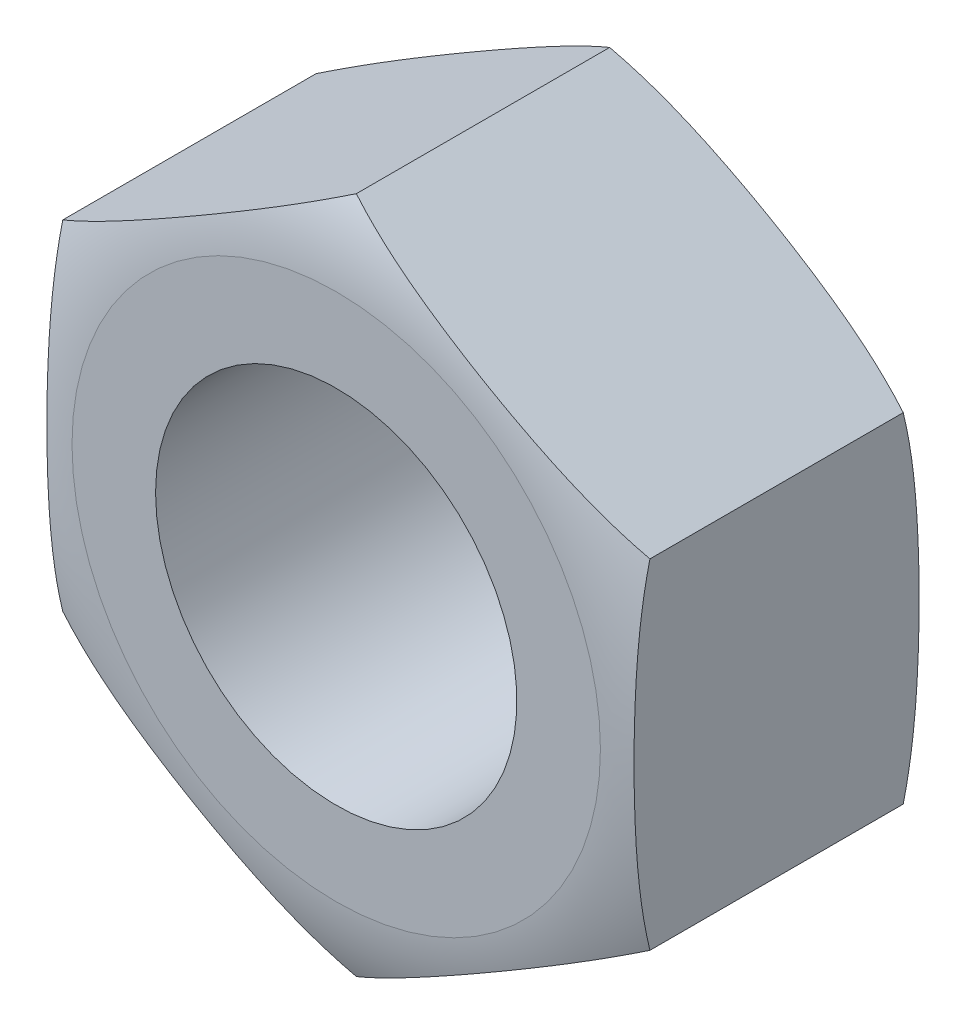
ISO-10303-21;
HEADER;
FILE_DESCRIPTION(('STEP AP214'),'2;1');
FILE_NAME('part.step','',(''),(''),'','','');
FILE_SCHEMA(('AUTOMOTIVE_DESIGN { 1 0 10303 214 1 1 1 1 }'));
ENDSEC;
DATA;
#1=APPLICATION_CONTEXT('core data for automotive mechanical design processes');
#2=APPLICATION_PROTOCOL_DEFINITION('international standard','automotive_design',2000,#1);
#3=PRODUCT_CONTEXT('',#1,'mechanical');
#4=PRODUCT('Part','Part','',(#3));
#5=PRODUCT_RELATED_PRODUCT_CATEGORY('part','',(#4));
#6=PRODUCT_DEFINITION_FORMATION('','',#4);
#7=PRODUCT_DEFINITION_CONTEXT('part definition',#1,'design');
#8=PRODUCT_DEFINITION('design','',#6,#7);
#9=PRODUCT_DEFINITION_SHAPE('','',#8);
#10=(LENGTH_UNIT() NAMED_UNIT(*) SI_UNIT(.MILLI.,.METRE.));
#11=(NAMED_UNIT(*) PLANE_ANGLE_UNIT() SI_UNIT($,.RADIAN.));
#12=(NAMED_UNIT(*) SI_UNIT($,.STERADIAN.) SOLID_ANGLE_UNIT());
#13=UNCERTAINTY_MEASURE_WITH_UNIT(LENGTH_MEASURE(1.E-05),#10,'distance_accuracy_value','');
#14=(GEOMETRIC_REPRESENTATION_CONTEXT(3) GLOBAL_UNCERTAINTY_ASSIGNED_CONTEXT((#13)) GLOBAL_UNIT_ASSIGNED_CONTEXT((#10,
#11,#12)) REPRESENTATION_CONTEXT('',''));
#15=CARTESIAN_POINT('',(0.,0.,0.));
#16=DIRECTION('',(0.,0.,1.));
#17=DIRECTION('',(1.,0.,0.));
#18=AXIS2_PLACEMENT_3D('',#15,#16,#17);
#19=CARTESIAN_POINT('',(-6.5,-3.75277674973257,0.));
#20=DIRECTION('',(-0.499999999999999,-0.866025403784439,0.));
#21=DIRECTION('',(0.866025403784439,-0.499999999999999,0.));
#22=AXIS2_PLACEMENT_3D('',#19,#20,#21);
#23=PLANE('',#22);
#24=CARTESIAN_POINT('',(-6.4999999999951,-3.75277674973539,-0.44572357986711));
#25=CARTESIAN_POINT('',(-6.368450040803,-3.82872715408684,-0.408618470883462));
#26=CARTESIAN_POINT('',(-6.23608776526573,-3.90514654949884,-0.375601053638122));
#27=CARTESIAN_POINT('',(-5.97026407564765,-4.05861992825681,-0.316718428748714));
#28=CARTESIAN_POINT('',(-5.83680349779314,-4.13567342880732,-0.290848219829598));
#29=CARTESIAN_POINT('',(-5.56939253886856,-4.29006321792668,-0.245233700435676));
#30=CARTESIAN_POINT('',(-5.43544368616804,-4.36739862409096,-0.225477154032766));
#31=CARTESIAN_POINT('',(-5.16703730043745,-4.52236312314474,-0.191050748299597));
#32=CARTESIAN_POINT('',(-5.03257967274308,-4.59999227068868,-0.176381887933316));
#33=CARTESIAN_POINT('',(-4.7633216465234,-4.75544846460808,-0.151265096656616));
#34=CARTESIAN_POINT('',(-4.62852113217613,-4.83327557785338,-0.140818860549731));
#35=CARTESIAN_POINT('',(-4.35874977954435,-4.98902814091498,-0.123427298866689));
#36=CARTESIAN_POINT('',(-4.22377893499881,-5.0669535943461,-0.116482105976505));
#37=CARTESIAN_POINT('',(-3.95584957944127,-5.22164267990105,-0.105623597627342));
#38=CARTESIAN_POINT('',(-3.82289240998474,-5.29840553747747,-0.101664819635423));
#39=CARTESIAN_POINT('',(-3.55693979498536,-5.45195335133904,-0.096265182081627));
#40=CARTESIAN_POINT('',(-3.42394434916413,-5.52873830778492,-0.0948243413204007));
#41=CARTESIAN_POINT('',(-3.15788410360645,-5.68234826217831,-0.0943305243682219));
#42=CARTESIAN_POINT('',(-3.02481930228376,-5.75917326104163,-0.0952787365012622));
#43=CARTESIAN_POINT('',(-2.75871721010348,-5.91280737559384,-0.0996515393486421));
#44=CARTESIAN_POINT('',(-2.62567991969272,-5.98961649102474,-0.103076167541168));
#45=CARTESIAN_POINT('',(-2.35970137523026,-6.14317927526881,-0.112698458153194));
#46=CARTESIAN_POINT('',(-2.22676010874288,-6.21993295126171,-0.118895651549672));
#47=CARTESIAN_POINT('',(-1.96102514909866,-6.37335510174539,-0.134553718769911));
#48=CARTESIAN_POINT('',(-1.82823144731737,-6.45002358121551,-0.144014390571887));
#49=CARTESIAN_POINT('',(-1.60071067527127,-6.58138276020255,-0.163606483940176));
#50=CARTESIAN_POINT('',(-1.50592177239597,-6.6361091587938,-0.172778139397991));
#51=CARTESIAN_POINT('',(-1.31656938197012,-6.74543181237786,-0.193412297813003));
#52=CARTESIAN_POINT('',(-1.2220058161491,-6.80002811256016,-0.204873831994563));
#53=CARTESIAN_POINT('',(-1.03317708594434,-6.90904843077461,-0.230399342474371));
#54=CARTESIAN_POINT('',(-0.93891182056807,-6.96347250711483,-0.244462313690016));
#55=CARTESIAN_POINT('',(-0.750275258575396,-7.07238187696031,-0.275608769491587));
#56=CARTESIAN_POINT('',(-0.655905766995885,-7.12686612832703,-0.292706931049049));
#57=CARTESIAN_POINT('',(-0.467612270980036,-7.23557742893843,-0.330244785971884));
#58=CARTESIAN_POINT('',(-0.373688515865849,-7.28980433423691,-0.350686164199396));
#59=CARTESIAN_POINT('',(-0.186369608033858,-7.39795295609802,-0.395307666837273));
#60=CARTESIAN_POINT('',(-0.0929754184926417,-7.45187411657038,-0.419493165906775));
#61=CARTESIAN_POINT('',(-2.44560216192224E-12,-7.50555349946372,-0.445723579867798));
#62=B_SPLINE_CURVE_WITH_KNOTS('',3,(#24,#25,#26,#27,#28,#29,#30,#31,#32,#33,#34,#35,#36,#37,#38,
#39,#40,#41,#42,#43,#44,#45,#46,#47,#48,#49,#50,#51,#52,#53,#54,#55,#56,#57,#58,#59,#60,#61),
.UNSPECIFIED.,.F.,.F.,(4,2,2,2,2,2,2,2,2,2,2,2,2,2,2,2,2,2,4),(0.,0.46896002310077,
0.937591054381121,1.40527800569045,1.87305673512337,2.34102302747653,2.80900705394247,
3.26971455968747,3.73042550537656,4.19136565567745,4.65231278201215,5.11318196135551,
5.57402261625363,5.90351157303367,6.23286142746765,6.56208430014446,6.89294482630111,
7.22397261110362,7.55548006728071),.UNSPECIFIED.);
#63=CARTESIAN_POINT('',(-6.5,-3.75277674973212,-0.445723579862922));
#64=VERTEX_POINT('',#63);
#65=CARTESIAN_POINT('',(5.31514829684612E-13,-7.50555349946341,-0.445723579866161));
#66=VERTEX_POINT('',#65);
#67=EDGE_CURVE('E299',#64,#66,#62,.T.);
#68=ORIENTED_EDGE('',*,*,#67,.F.);
#69=DIRECTION('',(0.,0.,1.));
#70=VECTOR('',#69,1.);
#71=CARTESIAN_POINT('',(-6.5,-3.75277674973318,0.));
#72=LINE('',#71,#70);
#73=CARTESIAN_POINT('',(-6.49999999999755,-3.75277674973429,-6.05427642013758));
#74=VERTEX_POINT('',#73);
#75=EDGE_CURVE('E155',#74,#64,#72,.T.);
#76=ORIENTED_EDGE('',*,*,#75,.F.);
#77=CARTESIAN_POINT('',(-2.4489352972453E-12,-7.50555349946371,-6.0542764201322));
#78=CARTESIAN_POINT('',(-0.131549959194365,-7.42960309511238,-6.09138152911585));
#79=CARTESIAN_POINT('',(-0.263912234731453,-7.35318369970049,-6.1243989463612));
#80=CARTESIAN_POINT('',(-0.529735924349159,-7.19971032094273,-6.18328157125064));
#81=CARTESIAN_POINT('',(-0.663196502203481,-7.12265682039233,-6.20915178016977));
#82=CARTESIAN_POINT('',(-0.930607461127693,-6.96826703127318,-6.25476629956374));
#83=CARTESIAN_POINT('',(-1.06455631382802,-6.89093162510901,-6.27452284596668));
#84=CARTESIAN_POINT('',(-1.33296269955823,-6.73596712605545,-6.30894925169991));
#85=CARTESIAN_POINT('',(-1.46742032725242,-6.65833797851162,-6.32361811206622));
#86=CARTESIAN_POINT('',(-1.73667835347172,-6.50288178459244,-6.34873490334298));
#87=CARTESIAN_POINT('',(-1.8714788678188,-6.42505467134725,-6.3591811394499));
#88=CARTESIAN_POINT('',(-2.14125022045021,-6.26930210828586,-6.37657270113301));
#89=CARTESIAN_POINT('',(-2.27622106499555,-6.19137665485485,-6.38351789402323));
#90=CARTESIAN_POINT('',(-2.54415042055273,-6.03668756930011,-6.39437640237246));
#91=CARTESIAN_POINT('',(-2.67710759000909,-5.9599247117238,-6.39833518036441));
#92=CARTESIAN_POINT('',(-2.94306020500811,-5.80637689786243,-6.40373481791828));
#93=CARTESIAN_POINT('',(-3.07605565082916,-5.72959194141665,-6.40517565867955));
#94=CARTESIAN_POINT('',(-3.34211589638649,-5.57598198702347,-6.40566947563181));
#95=CARTESIAN_POINT('',(-3.47518069770901,-5.49915698816025,-6.40472126349881));
#96=CARTESIAN_POINT('',(-3.74128278988894,-5.34552287360824,-6.40034846065153));
#97=CARTESIAN_POINT('',(-3.87432008029952,-5.26871375817743,-6.39692383245906));
#98=CARTESIAN_POINT('',(-4.14029862476164,-5.11515097393356,-6.38730154184715));
#99=CARTESIAN_POINT('',(-4.27323989124884,-5.03839729794077,-6.38110434845075));
#100=CARTESIAN_POINT('',(-4.53897485089272,-4.88497514745728,-6.36544628123066));
#101=CARTESIAN_POINT('',(-4.67176855267385,-4.80830666798726,-6.35598560942878));
#102=CARTESIAN_POINT('',(-4.89928932472013,-4.67694748900011,-6.33639351606063));
#103=CARTESIAN_POINT('',(-4.9940782275958,-4.62222109040865,-6.32722186060284));
#104=CARTESIAN_POINT('',(-5.18343061802237,-4.51289843682417,-6.30658770218788));
#105=CARTESIAN_POINT('',(-5.27799418384375,-4.45830213664167,-6.29512616800634));
#106=CARTESIAN_POINT('',(-5.46682291404923,-4.3492818184268,-6.26960065752656));
#107=CARTESIAN_POINT('',(-5.56108817942586,-4.29485774208637,-6.25553768631092));
#108=CARTESIAN_POINT('',(-5.74972474141926,-4.18594837224047,-6.22439123050935));
#109=CARTESIAN_POINT('',(-5.84409423299913,-4.13146412087355,-6.20729306895189));
#110=CARTESIAN_POINT('',(-6.03238772901571,-4.02275282026172,-6.16975521402902));
#111=CARTESIAN_POINT('',(-6.12631148413026,-3.96852591496304,-6.14931383580148));
#112=CARTESIAN_POINT('',(-6.31363039196297,-3.86037729310151,-6.10469233316353));
#113=CARTESIAN_POINT('',(-6.40702458150455,-3.80645613262894,-6.08050683409398));
#114=CARTESIAN_POINT('',(-6.49999999999511,-3.75277674973539,-6.05427642013289));
#115=B_SPLINE_CURVE_WITH_KNOTS('',3,(#77,#78,#79,#80,#81,#82,#83,#84,#85,#86,#87,#88,#89,#90,
#91,#92,#93,#94,#95,#96,#97,#98,#99,#100,#101,#102,#103,#104,#105,#106,#107,#108,#109,#110,#111,
#112,#113,#114),.UNSPECIFIED.,.F.,.F.,(4,2,2,2,2,2,2,2,2,2,2,2,2,2,2,2,2,2,4),(0.,
0.468960023100145,0.937591054379874,1.40527800568856,1.87305673512084,2.34102302747336,
2.80900705393865,3.26971455968304,3.73042550537152,4.1913656556718,4.65231278200589,
5.11318196134865,5.57402261624617,5.90351157302745,6.23286142746267,6.56208430014071,
6.8929448262986,7.22397261110236,7.55548006728071),.UNSPECIFIED.);
#116=CARTESIAN_POINT('',(5.3215594402981E-13,-7.50555349946341,-6.05427642013384));
#117=VERTEX_POINT('',#116);
#118=EDGE_CURVE('E303',#117,#74,#115,.T.);
#119=ORIENTED_EDGE('',*,*,#118,.F.);
#120=DIRECTION('',(0.,0.,1.));
#121=VECTOR('',#120,1.);
#122=CARTESIAN_POINT('',(3.50874024150871E-12,-7.50555349946311,0.));
#123=LINE('',#122,#121);
#124=EDGE_CURVE('E151',#66,#117,#123,.F.);
#125=ORIENTED_EDGE('',*,*,#124,.F.);
#126=EDGE_LOOP('',(#68,#76,#119,#125));
#127=FACE_BOUND('',#126,.T.);
#128=ADVANCED_FACE('F17',(#127),#23,.T.);
#129=CARTESIAN_POINT('',(-6.5,3.75277674973257,0.));
#130=DIRECTION('',(-1.,0.,0.));
#131=DIRECTION('',(0.,0.,1.));
#132=AXIS2_PLACEMENT_3D('',#129,#130,#131);
#133=PLANE('',#132);
#134=CARTESIAN_POINT('',(-6.5,3.75277674972691,-0.44572357986711));
#135=CARTESIAN_POINT('',(-6.5,3.60087594102402,-0.408618470883461));
#136=CARTESIAN_POINT('',(-6.5,3.44803715020003,-0.375601053638121));
#137=CARTESIAN_POINT('',(-6.5,3.14109039268407,-0.316718428748712));
#138=CARTESIAN_POINT('',(-6.5,2.98698339158306,-0.290848219829596));
#139=CARTESIAN_POINT('',(-6.5,2.67820381334433,-0.245233700435674));
#140=CARTESIAN_POINT('',(-6.5,2.52353300101576,-0.225477154032764));
#141=CARTESIAN_POINT('',(-6.5,2.21360400290822,-0.191050748299595));
#142=CARTESIAN_POINT('',(-6.5,2.05834570782033,-0.176381887933315));
#143=CARTESIAN_POINT('',(-6.5,1.74743331998154,-0.151265096656615));
#144=CARTESIAN_POINT('',(-6.5,1.59177909349094,-0.140818860549729));
#145=CARTESIAN_POINT('',(-6.5,1.28027396736772,-0.123427298866688));
#146=CARTESIAN_POINT('',(-6.5,1.12442306050549,-0.116482105976505));
#147=CARTESIAN_POINT('',(-6.5,0.815044889395584,-0.105623597627342));
#148=CARTESIAN_POINT('',(-6.5,0.661519174242748,-0.101664819635422));
#149=CARTESIAN_POINT('',(-6.5,0.354423546519598,-0.0962651820816266));
#150=CARTESIAN_POINT('',(-6.5,0.200853633627835,-0.0948243413204012));
#151=CARTESIAN_POINT('',(-6.5,-0.106366275158931,-0.094330524368223));
#152=CARTESIAN_POINT('',(-6.5,-0.26001627288557,-0.0952787365012633));
#153=CARTESIAN_POINT('',(-6.5,-0.567284501989984,-0.0996515393486431));
#154=CARTESIAN_POINT('',(-6.5,-0.720902732851801,-0.103076167541168));
#155=CARTESIAN_POINT('',(-6.5,-1.02802830133994,-0.112698458153195));
#156=CARTESIAN_POINT('',(-6.5,-1.18153565332573,-0.118895651549673));
#157=CARTESIAN_POINT('',(-6.5,-1.4883799542931,-0.134553718769913));
#158=CARTESIAN_POINT('',(-6.5,-1.64171691323334,-0.14401439057189));
#159=CARTESIAN_POINT('',(-6.5,-1.9044352712075,-0.163606483940184));
#160=CARTESIAN_POINT('',(-6.5,-2.01388806839006,-0.172778139398006));
#161=CARTESIAN_POINT('',(-6.5,-2.23253337555833,-0.193412297813034));
#162=CARTESIAN_POINT('',(-6.5,-2.34172597592301,-0.204873831994605));
#163=CARTESIAN_POINT('',(-6.5,-2.55976661235205,-0.230399342474437));
#164=CARTESIAN_POINT('',(-6.5,-2.66861476503257,-0.244462313690096));
#165=CARTESIAN_POINT('',(-6.5,-2.88643350472367,-0.275608769491701));
#166=CARTESIAN_POINT('',(-6.5,-2.99540200745718,-0.292706931049183));
#167=CARTESIAN_POINT('',(-6.5,-3.21282460868013,-0.330244785972062));
#168=CARTESIAN_POINT('',(-6.5,-3.32127841927716,-0.350686164199598));
#169=CARTESIAN_POINT('',(-6.5,-3.53757566299951,-0.395307666837531));
#170=CARTESIAN_POINT('',(-6.5,-3.64541798394432,-0.419493165907064));
#171=CARTESIAN_POINT('',(-6.5,-3.75277674973106,-0.445723579868123));
#172=B_SPLINE_CURVE_WITH_KNOTS('',3,(#134,#135,#136,#137,#138,#139,#140,#141,#142,#143,#144,
#145,#146,#147,#148,#149,#150,#151,#152,#153,#154,#155,#156,#157,#158,#159,#160,#161,#162,#163,
#164,#165,#166,#167,#168,#169,#170,#171),.UNSPECIFIED.,.F.,.F.,(4,2,2,2,2,2,2,2,2,2,2,2,2,2,2,2,
2,2,4),(0.,0.468960023100774,0.937591054381128,1.40527800569046,1.87305673512338,
2.34102302747654,2.80900705394249,3.26971455968748,3.73042550537657,4.19136565567746,
4.65231278201216,5.11318196135552,5.57402261625364,5.9035115730339,6.23286142746811,
6.56208430014513,6.89294482630201,7.22397261110474,7.55548006728206),.UNSPECIFIED.);
#173=CARTESIAN_POINT('',(-6.49999999999961,3.75277674973279,-0.445723579862921));
#174=VERTEX_POINT('',#173);
#175=EDGE_CURVE('E304',#174,#64,#172,.T.);
#176=ORIENTED_EDGE('',*,*,#175,.F.);
#177=DIRECTION('',(0.,0.,1.));
#178=VECTOR('',#177,1.);
#179=CARTESIAN_POINT('',(-6.50000000000053,3.75277674973226,0.));
#180=LINE('',#179,#178);
#181=CARTESIAN_POINT('',(-6.50000000000026,3.75277674972958,-6.05427642013759));
#182=VERTEX_POINT('',#181);
#183=EDGE_CURVE('E153',#182,#174,#180,.T.);
#184=ORIENTED_EDGE('',*,*,#183,.F.);
#185=CARTESIAN_POINT('',(-6.5,-3.75277674973106,-6.05427642013188));
#186=CARTESIAN_POINT('',(-6.5,-3.60087594102848,-6.09138152911553));
#187=CARTESIAN_POINT('',(-6.5,-3.44803715020481,-6.12439894636088));
#188=CARTESIAN_POINT('',(-6.5,-3.14109039268948,-6.18328157125033));
#189=CARTESIAN_POINT('',(-6.5,-2.98698339158879,-6.20915178016948));
#190=CARTESIAN_POINT('',(-6.5,-2.6782038133507,-6.25476629956347));
#191=CARTESIAN_POINT('',(-6.5,-2.52353300102245,-6.27452284596642));
#192=CARTESIAN_POINT('',(-6.5,-2.21360400291555,-6.30894925169967));
#193=CARTESIAN_POINT('',(-6.5,-2.05834570782798,-6.323618112066));
#194=CARTESIAN_POINT('',(-6.5,-1.74743331998982,-6.34873490334279));
#195=CARTESIAN_POINT('',(-6.5,-1.59177909349954,-6.35918113944972));
#196=CARTESIAN_POINT('',(-6.5,-1.28027396737697,-6.37657270113286));
#197=CARTESIAN_POINT('',(-6.5,-1.12442306051506,-6.3835178940231));
#198=CARTESIAN_POINT('',(-6.5,-0.815044889405774,-6.39437640237236));
#199=CARTESIAN_POINT('',(-6.5,-0.66151917425324,-6.39833518036434));
#200=CARTESIAN_POINT('',(-6.5,-0.354423546530692,-6.40373481791824));
#201=CARTESIAN_POINT('',(-6.5,-0.200853633639229,-6.40517565867952));
#202=CARTESIAN_POINT('',(-6.5,0.106366275146938,-6.40566947563182));
#203=CARTESIAN_POINT('',(-6.5,0.26001627287328,-6.40472126349884));
#204=CARTESIAN_POINT('',(-6.5,0.567284501977099,-6.40034846065161));
#205=CARTESIAN_POINT('',(-6.5,0.72090273283862,-6.39692383245916));
#206=CARTESIAN_POINT('',(-6.5,1.02802830132617,-6.38730154184732));
#207=CARTESIAN_POINT('',(-6.5,1.18153565331167,-6.38110434845094));
#208=CARTESIAN_POINT('',(-6.5,1.48837995427845,-6.36544628123094));
#209=CARTESIAN_POINT('',(-6.5,1.6417169132184,-6.35598560942909));
#210=CARTESIAN_POINT('',(-6.5,1.90443527119289,-6.336393516061));
#211=CARTESIAN_POINT('',(-6.5,2.01388806837607,-6.32722186060322));
#212=CARTESIAN_POINT('',(-6.5,2.23253337554557,-6.30658770218826));
#213=CARTESIAN_POINT('',(-6.5,2.34172597591086,-6.29512616800672));
#214=CARTESIAN_POINT('',(-6.5,2.55976661234113,-6.26960065752693));
#215=CARTESIAN_POINT('',(-6.5,2.66861476502227,-6.25553768631129));
#216=CARTESIAN_POINT('',(-6.5,2.8864335047146,-6.22439123050968));
#217=CARTESIAN_POINT('',(-6.5,2.99540200744873,-6.20729306895219));
#218=CARTESIAN_POINT('',(-6.5,3.21282460867292,-6.16975521402927));
#219=CARTESIAN_POINT('',(-6.5,3.32127841927056,-6.14931383580169));
#220=CARTESIAN_POINT('',(-6.5,3.53757566299414,-6.10469233316365));
#221=CARTESIAN_POINT('',(-6.5,3.64541798393956,-6.08050683409404));
#222=CARTESIAN_POINT('',(-6.5,3.75277674972691,-6.05427642013289));
#223=B_SPLINE_CURVE_WITH_KNOTS('',3,(#185,#186,#187,#188,#189,#190,#191,#192,#193,#194,#195,
#196,#197,#198,#199,#200,#201,#202,#203,#204,#205,#206,#207,#208,#209,#210,#211,#212,#213,#214,
#215,#216,#217,#218,#219,#220,#221,#222),.UNSPECIFIED.,.F.,.F.,(4,2,2,2,2,2,2,2,2,2,2,2,2,2,2,2,
2,2,4),(0.,0.468960023099853,0.937591054379287,1.40527800568768,1.87305673511965,
2.34102302747187,2.80900705393686,3.26971455968095,3.73042550536914,4.19136565566914,
4.65231278200294,5.11318196134541,5.57402261624264,5.90351157302473,6.23286142746076,
6.56208430013961,6.89294482629832,7.2239726111029,7.55548006728206),.UNSPECIFIED.);
#224=EDGE_CURVE('E306',#74,#182,#223,.T.);
#225=ORIENTED_EDGE('',*,*,#224,.F.);
#226=ORIENTED_EDGE('',*,*,#75,.T.);
#227=EDGE_LOOP('',(#176,#184,#225,#226));
#228=FACE_BOUND('',#227,.T.);
#229=ADVANCED_FACE('F276',(#228),#133,.T.);
#230=CARTESIAN_POINT('',(0.,7.50555349946513,0.));
#231=DIRECTION('',(-0.5,0.866025403784439,0.));
#232=DIRECTION('',(-0.866025403784439,-0.5,0.));
#233=AXIS2_PLACEMENT_3D('',#230,#231,#232);
#234=PLANE('',#233);
#235=CARTESIAN_POINT('',(-6.49999999999869,3.75277674973332,-6.05427642013188));
#236=CARTESIAN_POINT('',(-6.36845004080686,3.82872715408461,-6.09138152911553));
#237=CARTESIAN_POINT('',(-6.23608776526986,3.90514654949645,-6.12439894636088));
#238=CARTESIAN_POINT('',(-5.97026407565232,4.05861992825411,-6.18328157125034));
#239=CARTESIAN_POINT('',(-5.83680349779809,4.13567342880446,-6.20915178016948));
#240=CARTESIAN_POINT('',(-5.56939253887405,4.2900632179235,-6.25476629956347));
#241=CARTESIAN_POINT('',(-5.43544368617381,4.36739862408763,-6.27452284596642));
#242=CARTESIAN_POINT('',(-5.16703730044377,4.52236312314108,-6.30894925169967));
#243=CARTESIAN_POINT('',(-5.03257967274968,4.59999227068487,-6.323618112066));
#244=CARTESIAN_POINT('',(-4.76332164653055,4.75544846460394,-6.34873490334279));
#245=CARTESIAN_POINT('',(-4.62852113218355,4.83327557784909,-6.35918113944973));
#246=CARTESIAN_POINT('',(-4.35874977955232,4.98902814091037,-6.37657270113287));
#247=CARTESIAN_POINT('',(-4.22377893500707,5.06695359434133,-6.3835178940231));
#248=CARTESIAN_POINT('',(-3.95584957945006,5.22164267989597,-6.39437640237236));
#249=CARTESIAN_POINT('',(-3.82289240999379,5.29840553747224,-6.39833518036434));
#250=CARTESIAN_POINT('',(-3.55693979499494,5.45195335133351,-6.40373481791824));
#251=CARTESIAN_POINT('',(-3.42394434917397,5.52873830777924,-6.40517565867952));
#252=CARTESIAN_POINT('',(-3.15788410361681,5.68234826217233,-6.40566947563182));
#253=CARTESIAN_POINT('',(-3.02481930229438,5.7591732610355,-6.40472126349884));
#254=CARTESIAN_POINT('',(-2.75871721011461,5.9128073755874,-6.40034846065161));
#255=CARTESIAN_POINT('',(-2.62567991970412,5.98961649101816,-6.39692383245916));
#256=CARTESIAN_POINT('',(-2.35970137524216,6.14317927526194,-6.38730154184732));
#257=CARTESIAN_POINT('',(-2.22676010875504,6.21993295125469,-6.38110434845094));
#258=CARTESIAN_POINT('',(-1.96102514911133,6.37335510173808,-6.36544628123094));
#259=CARTESIAN_POINT('',(-1.82823144733028,6.45002358120805,-6.35598560942909));
#260=CARTESIAN_POINT('',(-1.6007106752837,6.58138276019538,-6.33639351606099));
#261=CARTESIAN_POINT('',(-1.50592177240767,6.63610915878705,-6.32722186060319));
#262=CARTESIAN_POINT('',(-1.31656938198035,6.74543181237196,-6.3065877021882));
#263=CARTESIAN_POINT('',(-1.22200581615859,6.80002811255468,-6.29512616800664));
#264=CARTESIAN_POINT('',(-1.03317708595237,6.90904843076998,-6.2696006575268));
#265=CARTESIAN_POINT('',(-0.938911820575367,6.96347250711062,-6.25553768631112));
#266=CARTESIAN_POINT('',(-0.750275258581227,7.07238187695694,-6.22439123050945));
#267=CARTESIAN_POINT('',(-0.655905767000981,7.12686612832409,-6.20729306895191));
#268=CARTESIAN_POINT('',(-0.467612270983666,7.23557742893634,-6.16975521402889));
#269=CARTESIAN_POINT('',(-0.373688515868749,7.28980433423524,-6.14931383580126));
#270=CARTESIAN_POINT('',(-0.186369608035303,7.39795295609718,-6.1046923331631));
#271=CARTESIAN_POINT('',(-0.0929754184933622,7.45187411656997,-6.08050683409343));
#272=CARTESIAN_POINT('',(-2.44652132712913E-12,7.50555349946371,-6.0542764201322));
#273=B_SPLINE_CURVE_WITH_KNOTS('',3,(#235,#236,#237,#238,#239,#240,#241,#242,#243,#244,#245,
#246,#247,#248,#249,#250,#251,#252,#253,#254,#255,#256,#257,#258,#259,#260,#261,#262,#263,#264,
#265,#266,#267,#268,#269,#270,#271,#272),.UNSPECIFIED.,.F.,.F.,(4,2,2,2,2,2,2,2,2,2,2,2,2,2,2,2,
2,2,4),(0.,0.468960023099859,0.937591054379296,1.40527800568769,1.87305673511967,
2.34102302747189,2.80900705393688,3.26971455968097,3.73042550536916,4.19136565566915,
4.65231278200296,5.11318196134543,5.57402261624265,5.90351157302522,6.23286142746173,
6.56208430014106,6.89294482630026,7.22397261110532,7.55548006728498),.UNSPECIFIED.);
#274=CARTESIAN_POINT('',(5.33870659345375E-13,7.50555349946341,-6.05427642013384));
#275=VERTEX_POINT('',#274);
#276=EDGE_CURVE('E127',#182,#275,#273,.T.);
#277=ORIENTED_EDGE('',*,*,#276,.F.);
#278=ORIENTED_EDGE('',*,*,#183,.T.);
#279=CARTESIAN_POINT('',(-2.44596838244786E-12,7.50555349946372,-0.445723579867799));
#280=CARTESIAN_POINT('',(-0.131549959194363,7.42960309511238,-0.408618470884148));
#281=CARTESIAN_POINT('',(-0.263912234731452,7.35318369970049,-0.375601053638799));
#282=CARTESIAN_POINT('',(-0.529735924349161,7.19971032094273,-0.316718428749362));
#283=CARTESIAN_POINT('',(-0.663196502203484,7.12265682039233,-0.290848219830227));
#284=CARTESIAN_POINT('',(-0.930607461127698,6.96826703127318,-0.245233700436258));
#285=CARTESIAN_POINT('',(-1.06455631382802,6.890931625109,-0.225477154033321));
#286=CARTESIAN_POINT('',(-1.33296269955824,6.73596712605545,-0.191050748300094));
#287=CARTESIAN_POINT('',(-1.46742032725242,6.65833797851162,-0.176381887933784));
#288=CARTESIAN_POINT('',(-1.73667835347173,6.50288178459243,-0.151265096657021));
#289=CARTESIAN_POINT('',(-1.87147886781881,6.42505467134724,-0.140818860550102));
#290=CARTESIAN_POINT('',(-2.14125022045022,6.26930210828585,-0.123427298866993));
#291=CARTESIAN_POINT('',(-2.27622106499557,6.19137665485484,-0.116482105976775));
#292=CARTESIAN_POINT('',(-2.54415042055275,6.0366875693001,-0.105623597627543));
#293=CARTESIAN_POINT('',(-2.6771075900091,5.95992471172379,-0.101664819635587));
#294=CARTESIAN_POINT('',(-2.94306020500812,5.80637689786242,-0.0962651820817178));
#295=CARTESIAN_POINT('',(-3.07605565082917,5.72959194141664,-0.0948243413204542));
#296=CARTESIAN_POINT('',(-3.34211589638649,5.57598198702346,-0.0943305243681933));
#297=CARTESIAN_POINT('',(-3.475180697709,5.49915698816025,-0.095278736501189));
#298=CARTESIAN_POINT('',(-3.74128278988893,5.34552287360824,-0.0996515393484702));
#299=CARTESIAN_POINT('',(-3.87432008029951,5.26871375817744,-0.103076167540941));
#300=CARTESIAN_POINT('',(-4.14029862476163,5.11515097393357,-0.112698458152845));
#301=CARTESIAN_POINT('',(-4.27323989124883,5.03839729794077,-0.118895651549253));
#302=CARTESIAN_POINT('',(-4.5389748508927,4.88497514745729,-0.134553718769334));
#303=CARTESIAN_POINT('',(-4.67176855267383,4.80830666798727,-0.14401439057122));
#304=CARTESIAN_POINT('',(-4.89928932472032,4.676947489,-0.163606483939389));
#305=CARTESIAN_POINT('',(-4.99407822759618,4.62222109040843,-0.172778139397197));
#306=CARTESIAN_POINT('',(-5.18343061802316,4.51289843682371,-0.193412297812212));
#307=CARTESIAN_POINT('',(-5.27799418384475,4.45830213664108,-0.204873831993784));
#308=CARTESIAN_POINT('',(-5.46682291405063,4.34928181842598,-0.23039934247364));
#309=CARTESIAN_POINT('',(-5.56108817942747,4.29485774208544,-0.244462313689321));
#310=CARTESIAN_POINT('',(-5.74972474142127,4.18594837223931,-0.275608769490996));
#311=CARTESIAN_POINT('',(-5.84409423300134,4.13146412087227,-0.292706931048524));
#312=CARTESIAN_POINT('',(-6.03238772901832,4.02275282026021,-0.33024478597153));
#313=CARTESIAN_POINT('',(-6.12631148413306,3.96852591496141,-0.350686164199147));
#314=CARTESIAN_POINT('',(-6.31363039196617,3.86037729309966,-0.395307666837276));
#315=CARTESIAN_POINT('',(-6.40702458150794,3.80645613262697,-0.419493165906925));
#316=CARTESIAN_POINT('',(-6.49999999999869,3.75277674973332,-0.445723579868121));
#317=B_SPLINE_CURVE_WITH_KNOTS('',3,(#279,#280,#281,#282,#283,#284,#285,#286,#287,#288,#289,
#290,#291,#292,#293,#294,#295,#296,#297,#298,#299,#300,#301,#302,#303,#304,#305,#306,#307,#308,
#309,#310,#311,#312,#313,#314,#315,#316),.UNSPECIFIED.,.F.,.F.,(4,2,2,2,2,2,2,2,2,2,2,2,2,2,2,2,
2,2,4),(0.,0.46896002310015,0.937591054379883,1.40527800568858,1.87305673512086,
2.34102302747338,2.80900705393867,3.26971455968305,3.73042550537153,4.1913656556718,
4.65231278200589,5.11318196134864,5.57402261624615,5.90351157302814,6.23286142746407,
6.56208430014282,6.89294482630143,7.22397261110591,7.55548006728498),.UNSPECIFIED.);
#318=CARTESIAN_POINT('',(1.75423911508155E-12,7.50555349946412,-0.445723579866506));
#319=VERTEX_POINT('',#318);
#320=EDGE_CURVE('E92',#319,#174,#317,.T.);
#321=ORIENTED_EDGE('',*,*,#320,.F.);
#322=DIRECTION('',(0.,0.,1.));
#323=VECTOR('',#322,1.);
#324=CARTESIAN_POINT('',(3.51368240059102E-12,7.50555349946311,0.));
#325=LINE('',#324,#323);
#326=EDGE_CURVE('E97',#275,#319,#325,.T.);
#327=ORIENTED_EDGE('',*,*,#326,.F.);
#328=EDGE_LOOP('',(#277,#278,#321,#327));
#329=FACE_BOUND('',#328,.T.);
#330=ADVANCED_FACE('F114',(#329),#234,.T.);
#331=CARTESIAN_POINT('',(0.,-7.50555349946513,0.));
#332=DIRECTION('',(0.5,-0.866025403784438,0.));
#333=DIRECTION('',(0.866025403784438,0.5,0.));
#334=AXIS2_PLACEMENT_3D('',#331,#332,#333);
#335=PLANE('',#334);
#336=CARTESIAN_POINT('',(6.49999999999903,-3.75277674973312,-6.05427642013178));
#337=CARTESIAN_POINT('',(6.36845004080723,-3.82872715408439,-6.09138152911544));
#338=CARTESIAN_POINT('',(6.23608776527025,-3.90514654949622,-6.12439894636079));
#339=CARTESIAN_POINT('',(5.97026407565277,-4.05861992825385,-6.18328157125024));
#340=CARTESIAN_POINT('',(5.83680349779856,-4.13567342880418,-6.20915178016939));
#341=CARTESIAN_POINT('',(5.56939253887457,-4.2900632179232,-6.25476629956339));
#342=CARTESIAN_POINT('',(5.43544368617436,-4.36739862408731,-6.27452284596634));
#343=CARTESIAN_POINT('',(5.16703730044438,-4.52236312314073,-6.3089492516996));
#344=CARTESIAN_POINT('',(5.03257967275031,-4.5999922706845,-6.32361811206593));
#345=CARTESIAN_POINT('',(4.76332164653124,-4.75544846460355,-6.34873490334273));
#346=CARTESIAN_POINT('',(4.62852113218426,-4.83327557784868,-6.35918113944967));
#347=CARTESIAN_POINT('',(4.35874977955309,-4.98902814090993,-6.37657270113282));
#348=CARTESIAN_POINT('',(4.22377893500785,-5.06695359434088,-6.38351789402306));
#349=CARTESIAN_POINT('',(3.9558495794509,-5.22164267989549,-6.39437640237234));
#350=CARTESIAN_POINT('',(3.82289240999465,-5.29840553747174,-6.39833518036431));
#351=CARTESIAN_POINT('',(3.55693979499585,-5.45195335133299,-6.40373481791823));
#352=CARTESIAN_POINT('',(3.4239443491749,-5.5287383077787,-6.40517565867951));
#353=CARTESIAN_POINT('',(3.1578841036178,-5.68234826217176,-6.40566947563183));
#354=CARTESIAN_POINT('',(3.02481930229539,-5.75917326103491,-6.40472126349885));
#355=CARTESIAN_POINT('',(2.75871721011567,-5.91280737558679,-6.40034846065163));
#356=CARTESIAN_POINT('',(2.6256799197052,-5.98961649101754,-6.3969238324592));
#357=CARTESIAN_POINT('',(2.35970137524329,-6.14317927526129,-6.38730154184737));
#358=CARTESIAN_POINT('',(2.2267601087562,-6.21993295125402,-6.381104348451));
#359=CARTESIAN_POINT('',(1.96102514911253,-6.37335510173739,-6.36544628123102));
#360=CARTESIAN_POINT('',(1.82823144733151,-6.45002358120735,-6.35598560942919));
#361=CARTESIAN_POINT('',(1.60071067528493,-6.58138276019467,-6.3363935160611));
#362=CARTESIAN_POINT('',(1.50592177240887,-6.63610915878635,-6.32722186060332));
#363=CARTESIAN_POINT('',(1.31656938198151,-6.74543181237129,-6.30658770218834));
#364=CARTESIAN_POINT('',(1.22200581615973,-6.80002811255403,-6.29512616800678));
#365=CARTESIAN_POINT('',(1.03317708595346,-6.90904843076935,-6.26960065752695));
#366=CARTESIAN_POINT('',(0.938911820576434,-6.96347250711001,-6.25553768631128));
#367=CARTESIAN_POINT('',(0.750275258582248,-7.07238187695636,-6.22439123050963));
#368=CARTESIAN_POINT('',(0.655905767001979,-7.12686612832351,-6.2072930689521));
#369=CARTESIAN_POINT('',(0.467612270984618,-7.23557742893579,-6.16975521402909));
#370=CARTESIAN_POINT('',(0.373688515869677,-7.2898043342347,-6.14931383580147));
#371=CARTESIAN_POINT('',(0.186369608036183,-7.39795295609668,-6.10469233316332));
#372=CARTESIAN_POINT('',(0.0929754184942186,-7.45187411656948,-6.08050683409365));
#373=CARTESIAN_POINT('',(3.28072432310187E-12,-7.50555349946324,-6.05427642013243));
#374=B_SPLINE_CURVE_WITH_KNOTS('',3,(#336,#337,#338,#339,#340,#341,#342,#343,#344,#345,#346,
#347,#348,#349,#350,#351,#352,#353,#354,#355,#356,#357,#358,#359,#360,#361,#362,#363,#364,#365,
#366,#367,#368,#369,#370,#371,#372,#373),.UNSPECIFIED.,.F.,.F.,(4,2,2,2,2,2,2,2,2,2,2,2,2,2,2,2,
2,2,4),(0.,0.46896002309977,0.937591054379121,1.40527800568743,1.87305673511932,
2.34102302747144,2.80900705393635,3.26971455968036,3.73042550536846,4.19136565566836,
4.65231278200208,5.11318196134447,5.57402261624161,5.90351157302426,6.23286142746085,
6.56208430014025,6.89294482629952,7.22397261110466,7.5554800672844),.UNSPECIFIED.);
#375=CARTESIAN_POINT('',(6.5,-3.75277674972656,-6.0542764201377));
#376=VERTEX_POINT('',#375);
#377=EDGE_CURVE('E120',#376,#117,#374,.T.);
#378=ORIENTED_EDGE('',*,*,#377,.F.);
#379=DIRECTION('',(0.,0.,-1.));
#380=VECTOR('',#379,1.);
#381=CARTESIAN_POINT('',(6.5,-3.75277674972717,0.));
#382=LINE('',#381,#380);
#383=CARTESIAN_POINT('',(6.49999999999952,-3.75277674973015,-0.445723579862969));
#384=VERTEX_POINT('',#383);
#385=EDGE_CURVE('E80',#384,#376,#382,.T.);
#386=ORIENTED_EDGE('',*,*,#385,.F.);
#387=CARTESIAN_POINT('',(3.27752608110381E-12,-7.50555349946324,-0.445723579867567));
#388=CARTESIAN_POINT('',(0.131549959195257,-7.42960309511187,-0.408618470883915));
#389=CARTESIAN_POINT('',(0.263912234732408,-7.35318369969994,-0.375601053638569));
#390=CARTESIAN_POINT('',(0.529735924350242,-7.19971032094211,-0.316718428749142));
#391=CARTESIAN_POINT('',(0.663196502204629,-7.12265682039167,-0.290848219830014));
#392=CARTESIAN_POINT('',(0.930607461128968,-6.96826703127245,-0.245233700436061));
#393=CARTESIAN_POINT('',(1.06455631382936,-6.89093162510824,-0.225477154033132));
#394=CARTESIAN_POINT('',(1.3329626995597,-6.73596712605461,-0.191050748299925));
#395=CARTESIAN_POINT('',(1.46742032725395,-6.65833797851074,-0.176381887933625));
#396=CARTESIAN_POINT('',(1.73667835347338,-6.50288178459148,-0.151265096656883));
#397=CARTESIAN_POINT('',(1.87147886782053,-6.42505467134625,-0.140818860549975));
#398=CARTESIAN_POINT('',(2.14125022045206,-6.26930210828479,-0.12342729886689));
#399=CARTESIAN_POINT('',(2.27622106499747,-6.19137665485374,-0.116482105976684));
#400=CARTESIAN_POINT('',(2.54415042055478,-6.03668756929893,-0.105623597627475));
#401=CARTESIAN_POINT('',(2.67710759001119,-5.95992471172258,-0.101664819635531));
#402=CARTESIAN_POINT('',(2.94306020501033,-5.80637689786114,-0.0962651820816871));
#403=CARTESIAN_POINT('',(3.07605565083144,-5.72959194141533,-0.0948243413204358));
#404=CARTESIAN_POINT('',(3.34211589638888,-5.57598198702208,-0.0943305243682026));
#405=CARTESIAN_POINT('',(3.47518069771145,-5.49915698815883,-0.0952787365012138));
#406=CARTESIAN_POINT('',(3.7412827898915,-5.34552287360676,-0.0996515393485288));
#407=CARTESIAN_POINT('',(3.87432008030214,-5.26871375817592,-0.103076167541018));
#408=CARTESIAN_POINT('',(4.14029862476437,-5.11515097393198,-0.112698458152964));
#409=CARTESIAN_POINT('',(4.27323989125163,-5.03839729793915,-0.118895651549396));
#410=CARTESIAN_POINT('',(4.53897485089562,-4.8849751474556,-0.134553718769529));
#411=CARTESIAN_POINT('',(4.67176855267681,-4.80830666798555,-0.144014390571446));
#412=CARTESIAN_POINT('',(4.8992893247232,-4.67694748899833,-0.163606483939658));
#413=CARTESIAN_POINT('',(4.99407822759892,-4.62222109040685,-0.172778139397473));
#414=CARTESIAN_POINT('',(5.1834306180256,-4.5128984368223,-0.193412297812498));
#415=CARTESIAN_POINT('',(5.27799418384704,-4.45830213663977,-0.204873831994073));
#416=CARTESIAN_POINT('',(5.46682291405262,-4.34928181842484,-0.230399342473928));
#417=CARTESIAN_POINT('',(5.5610881794293,-4.29485774208438,-0.244462313689606));
#418=CARTESIAN_POINT('',(5.7497247414228,-4.18594837223842,-0.275608769491267));
#419=CARTESIAN_POINT('',(5.84409423300273,-4.13146412087147,-0.292706931048785));
#420=CARTESIAN_POINT('',(6.0323877290194,-4.02275282025958,-0.330244785971761));
#421=CARTESIAN_POINT('',(6.126311484134,-3.96852591496087,-0.350686164199358));
#422=CARTESIAN_POINT('',(6.31363039196681,-3.86037729309929,-0.395307666837438));
#423=CARTESIAN_POINT('',(6.40702458150843,-3.80645613262669,-0.419493165907057));
#424=CARTESIAN_POINT('',(6.49999999999903,-3.75277674973312,-0.445723579868216));
#425=B_SPLINE_CURVE_WITH_KNOTS('',3,(#387,#388,#389,#390,#391,#392,#393,#394,#395,#396,#397,
#398,#399,#400,#401,#402,#403,#404,#405,#406,#407,#408,#409,#410,#411,#412,#413,#414,#415,#416,
#417,#418,#419,#420,#421,#422,#423,#424),.UNSPECIFIED.,.F.,.F.,(4,2,2,2,2,2,2,2,2,2,2,2,2,2,2,2,
2,2,4),(0.,0.46896002310036,0.937591054380303,1.40527800568921,1.87305673512171,
2.34102302747445,2.80900705393996,3.26971455968455,3.73042550537323,4.19136565567371,
4.65231278200801,5.11318196135097,5.57402261624868,5.90351157303015,6.23286142746557,
6.5620843001438,6.89294482630189,7.22397261110585,7.55548006728439),.UNSPECIFIED.);
#426=EDGE_CURVE('E90',#66,#384,#425,.T.);
#427=ORIENTED_EDGE('',*,*,#426,.F.);
#428=ORIENTED_EDGE('',*,*,#124,.T.);
#429=EDGE_LOOP('',(#378,#386,#427,#428));
#430=FACE_BOUND('',#429,.T.);
#431=ADVANCED_FACE('F110',(#430),#335,.T.);
#432=CARTESIAN_POINT('',(6.5,3.75277674973257,0.));
#433=DIRECTION('',(0.5,0.866025403784439,0.));
#434=DIRECTION('',(-0.866025403784439,0.5,0.));
#435=AXIS2_PLACEMENT_3D('',#432,#433,#434);
#436=PLANE('',#435);
#437=CARTESIAN_POINT('',(3.28103082418213E-12,7.50555349946324,-6.05427642013243));
#438=CARTESIAN_POINT('',(0.13154995919526,7.42960309511187,-6.09138152911608));
#439=CARTESIAN_POINT('',(0.26391223473241,7.35318369969994,-6.12439894636143));
#440=CARTESIAN_POINT('',(0.529735924350241,7.19971032094211,-6.18328157125086));
#441=CARTESIAN_POINT('',(0.663196502204626,7.12265682039168,-6.20915178016999));
#442=CARTESIAN_POINT('',(0.930607461128963,6.96826703127246,-6.25476629956394));
#443=CARTESIAN_POINT('',(1.06455631382935,6.89093162510824,-6.27452284596687));
#444=CARTESIAN_POINT('',(1.33296269955969,6.73596712605462,-6.30894925170007));
#445=CARTESIAN_POINT('',(1.46742032725394,6.65833797851075,-6.32361811206637));
#446=CARTESIAN_POINT('',(1.73667835347336,6.50288178459149,-6.34873490334311));
#447=CARTESIAN_POINT('',(1.87147886782052,6.42505467134627,-6.35918113945002));
#448=CARTESIAN_POINT('',(2.14125022045205,6.2693021082848,-6.37657270113311));
#449=CARTESIAN_POINT('',(2.27622106499746,6.19137665485376,-6.38351789402332));
#450=CARTESIAN_POINT('',(2.54415042055476,6.03668756929895,-6.39437640237252));
#451=CARTESIAN_POINT('',(2.67710759001117,5.9599247117226,-6.39833518036447));
#452=CARTESIAN_POINT('',(2.94306020501031,5.80637689786116,-6.40373481791831));
#453=CARTESIAN_POINT('',(3.07605565083143,5.72959194141534,-6.40517565867956));
#454=CARTESIAN_POINT('',(3.34211589638887,5.57598198702209,-6.4056694756318));
#455=CARTESIAN_POINT('',(3.47518069771145,5.49915698815884,-6.40472126349879));
#456=CARTESIAN_POINT('',(3.7412827898915,5.34552287360677,-6.40034846065147));
#457=CARTESIAN_POINT('',(3.87432008030214,5.26871375817592,-6.39692383245898));
#458=CARTESIAN_POINT('',(4.14029862476438,5.11515097393198,-6.38730154184704));
#459=CARTESIAN_POINT('',(4.27323989125164,5.03839729793916,-6.3811043484506));
#460=CARTESIAN_POINT('',(4.53897485089563,4.8849751474556,-6.36544628123047));
#461=CARTESIAN_POINT('',(4.67176855267682,4.80830666798555,-6.35598560942855));
#462=CARTESIAN_POINT('',(4.89928932472299,4.67694748899846,-6.33639351606036));
#463=CARTESIAN_POINT('',(4.99407822759848,4.6222210904071,-6.32722186060257));
#464=CARTESIAN_POINT('',(5.18343061802472,4.51289843682282,-6.3065877021876));
#465=CARTESIAN_POINT('',(5.27799418384594,4.45830213664041,-6.29512616800606));
#466=CARTESIAN_POINT('',(5.46682291405108,4.34928181842574,-6.26960065752629));
#467=CARTESIAN_POINT('',(5.56108817942754,4.2948577420854,-6.25553768631066));
#468=CARTESIAN_POINT('',(5.7497247414206,4.1859483722397,-6.22439123050912));
#469=CARTESIAN_POINT('',(5.84409423300031,4.13146412087287,-6.20729306895166));
#470=CARTESIAN_POINT('',(6.03238772901654,4.02275282026124,-6.16975521402884));
#471=CARTESIAN_POINT('',(6.12631148413092,3.96852591496265,-6.14931383580133));
#472=CARTESIAN_POINT('',(6.3136303919633,3.86037729310132,-6.10469233316344));
#473=CARTESIAN_POINT('',(6.40702458150471,3.80645613262884,-6.08050683409393));
#474=CARTESIAN_POINT('',(6.4999999999951,3.7527767497354,-6.05427642013289));
#475=B_SPLINE_CURVE_WITH_KNOTS('',3,(#437,#438,#439,#440,#441,#442,#443,#444,#445,#446,#447,
#448,#449,#450,#451,#452,#453,#454,#455,#456,#457,#458,#459,#460,#461,#462,#463,#464,#465,#466,
#467,#468,#469,#470,#471,#472,#473,#474),.UNSPECIFIED.,.F.,.F.,(4,2,2,2,2,2,2,2,2,2,2,2,2,2,2,2,
2,2,4),(0.,0.468960023100356,0.937591054380294,1.4052780056892,1.87305673512169,
2.34102302747443,2.80900705393994,3.26971455968453,3.73042550537322,4.1913656556737,
4.652312782008,5.11318196135097,5.57402261624869,5.90351157302938,6.23286142746402,
6.56208430014148,6.89294482629879,7.22397261110197,7.55548006727972),.UNSPECIFIED.);
#476=CARTESIAN_POINT('',(6.49999999999755,3.75277674973429,-6.05427642013758));
#477=VERTEX_POINT('',#476);
#478=EDGE_CURVE('E41',#275,#477,#475,.T.);
#479=ORIENTED_EDGE('',*,*,#478,.F.);
#480=ORIENTED_EDGE('',*,*,#326,.T.);
#481=CARTESIAN_POINT('',(6.4999999999951,3.7527767497354,-0.44572357986711));
#482=CARTESIAN_POINT('',(6.368450040803,3.82872715408684,-0.408618470883461));
#483=CARTESIAN_POINT('',(6.23608776526573,3.90514654949884,-0.375601053638121));
#484=CARTESIAN_POINT('',(5.97026407564765,4.05861992825681,-0.316718428748713));
#485=CARTESIAN_POINT('',(5.83680349779314,4.13567342880732,-0.290848219829597));
#486=CARTESIAN_POINT('',(5.56939253886856,4.29006321792668,-0.245233700435675));
#487=CARTESIAN_POINT('',(5.43544368616804,4.36739862409097,-0.225477154032765));
#488=CARTESIAN_POINT('',(5.16703730043745,4.52236312314474,-0.191050748299596));
#489=CARTESIAN_POINT('',(5.03257967274308,4.59999227068868,-0.176381887933316));
#490=CARTESIAN_POINT('',(4.7633216465234,4.75544846460808,-0.151265096656617));
#491=CARTESIAN_POINT('',(4.62852113217613,4.83327557785338,-0.140818860549731));
#492=CARTESIAN_POINT('',(4.35874977954435,4.98902814091499,-0.123427298866689));
#493=CARTESIAN_POINT('',(4.22377893499881,5.0669535943461,-0.116482105976506));
#494=CARTESIAN_POINT('',(3.95584957944127,5.22164267990105,-0.105623597627343));
#495=CARTESIAN_POINT('',(3.82289240998474,5.29840553747747,-0.101664819635423));
#496=CARTESIAN_POINT('',(3.55693979498536,5.45195335133905,-0.0962651820816273));
#497=CARTESIAN_POINT('',(3.42394434916413,5.52873830778493,-0.0948243413204017));
#498=CARTESIAN_POINT('',(3.15788410360645,5.68234826217831,-0.0943305243682231));
#499=CARTESIAN_POINT('',(3.02481930228376,5.75917326104163,-0.0952787365012631));
#500=CARTESIAN_POINT('',(2.75871721010348,5.91280737559384,-0.0996515393486427));
#501=CARTESIAN_POINT('',(2.62567991969272,5.98961649102475,-0.103076167541168));
#502=CARTESIAN_POINT('',(2.35970137523025,6.14317927526882,-0.112698458153195));
#503=CARTESIAN_POINT('',(2.22676010874288,6.21993295126172,-0.118895651549673));
#504=CARTESIAN_POINT('',(1.96102514909866,6.3733551017454,-0.134553718769913));
#505=CARTESIAN_POINT('',(1.82823144731736,6.45002358121552,-0.14401439057189));
#506=CARTESIAN_POINT('',(1.60071067527132,6.58138276020254,-0.163606483940174));
#507=CARTESIAN_POINT('',(1.50592177239606,6.63610915879375,-0.172778139397984));
#508=CARTESIAN_POINT('',(1.31656938197031,6.74543181237776,-0.193412297812983));
#509=CARTESIAN_POINT('',(1.22200581614933,6.80002811256003,-0.204873831994536));
#510=CARTESIAN_POINT('',(1.03317708594467,6.90904843077443,-0.230399342474327));
#511=CARTESIAN_POINT('',(0.93891182056844,6.96347250711463,-0.244462313689961));
#512=CARTESIAN_POINT('',(0.75027525857586,7.07238187696005,-0.275608769491508));
#513=CARTESIAN_POINT('',(0.655905766996396,7.12686612832674,-0.292706931048956));
#514=CARTESIAN_POINT('',(0.46761227098064,7.23557742893809,-0.33024478597176));
#515=CARTESIAN_POINT('',(0.373688515866499,7.28980433423654,-0.350686164199254));
#516=CARTESIAN_POINT('',(0.186369608034599,7.39795295609759,-0.395307666837091));
#517=CARTESIAN_POINT('',(0.0929754184934285,7.45187411656994,-0.41949316590657));
#518=CARTESIAN_POINT('',(3.27697135761453E-12,7.50555349946324,-0.445723579867568));
#519=B_SPLINE_CURVE_WITH_KNOTS('',3,(#481,#482,#483,#484,#485,#486,#487,#488,#489,#490,#491,
#492,#493,#494,#495,#496,#497,#498,#499,#500,#501,#502,#503,#504,#505,#506,#507,#508,#509,#510,
#511,#512,#513,#514,#515,#516,#517,#518),.UNSPECIFIED.,.F.,.F.,(4,2,2,2,2,2,2,2,2,2,2,2,2,2,2,2,
2,2,4),(0.,0.46896002310077,0.937591054381121,1.40527800569045,1.87305673512337,
2.34102302747653,2.80900705394247,3.26971455968747,3.73042550537656,4.19136565567745,
4.65231278201215,5.11318196135552,5.57402261625363,5.90351157303351,6.23286142746733,
6.56208430014397,6.89294482630045,7.2239726111028,7.55548006727972),.UNSPECIFIED.);
#520=CARTESIAN_POINT('',(6.5,3.75277674973212,-0.445723579862922));
#521=VERTEX_POINT('',#520);
#522=EDGE_CURVE('E21',#521,#319,#519,.T.);
#523=ORIENTED_EDGE('',*,*,#522,.F.);
#524=DIRECTION('',(0.,0.,-1.));
#525=VECTOR('',#524,1.);
#526=CARTESIAN_POINT('',(6.5,3.75277674973318,0.));
#527=LINE('',#526,#525);
#528=EDGE_CURVE('E73',#477,#521,#527,.F.);
#529=ORIENTED_EDGE('',*,*,#528,.F.);
#530=EDGE_LOOP('',(#479,#480,#523,#529));
#531=FACE_BOUND('',#530,.T.);
#532=ADVANCED_FACE('F95',(#531),#436,.T.);
#533=CARTESIAN_POINT('',(6.5,-3.75277674973256,0.));
#534=DIRECTION('',(1.,0.,0.));
#535=DIRECTION('',(0.,0.,-1.));
#536=AXIS2_PLACEMENT_3D('',#533,#534,#535);
#537=PLANE('',#536);
#538=CARTESIAN_POINT('',(6.5,3.75277674973106,-6.05427642013188));
#539=CARTESIAN_POINT('',(6.5,3.60087594102848,-6.09138152911553));
#540=CARTESIAN_POINT('',(6.5,3.44803715020481,-6.12439894636088));
#541=CARTESIAN_POINT('',(6.5,3.14109039268949,-6.18328157125033));
#542=CARTESIAN_POINT('',(6.5,2.98698339158879,-6.20915178016948));
#543=CARTESIAN_POINT('',(6.5,2.6782038133507,-6.25476629956347));
#544=CARTESIAN_POINT('',(6.5,2.52353300102245,-6.27452284596642));
#545=CARTESIAN_POINT('',(6.5,2.21360400291555,-6.30894925169967));
#546=CARTESIAN_POINT('',(6.5,2.05834570782798,-6.32361811206599));
#547=CARTESIAN_POINT('',(6.5,1.74743331998983,-6.34873490334279));
#548=CARTESIAN_POINT('',(6.5,1.59177909349955,-6.35918113944972));
#549=CARTESIAN_POINT('',(6.5,1.28027396737697,-6.37657270113286));
#550=CARTESIAN_POINT('',(6.5,1.12442306051506,-6.3835178940231));
#551=CARTESIAN_POINT('',(6.5,0.81504488940578,-6.39437640237236));
#552=CARTESIAN_POINT('',(6.5,0.661519174253245,-6.39833518036433));
#553=CARTESIAN_POINT('',(6.5,0.354423546530695,-6.40373481791824));
#554=CARTESIAN_POINT('',(6.5,0.200853633639233,-6.40517565867952));
#555=CARTESIAN_POINT('',(6.5,-0.106366275146936,-6.40566947563182));
#556=CARTESIAN_POINT('',(6.5,-0.260016272873278,-6.40472126349884));
#557=CARTESIAN_POINT('',(6.5,-0.567284501977098,-6.40034846065161));
#558=CARTESIAN_POINT('',(6.5,-0.720902732838619,-6.39692383245916));
#559=CARTESIAN_POINT('',(6.5,-1.02802830132617,-6.38730154184732));
#560=CARTESIAN_POINT('',(6.5,-1.18153565331167,-6.38110434845094));
#561=CARTESIAN_POINT('',(6.5,-1.48837995427845,-6.36544628123094));
#562=CARTESIAN_POINT('',(6.5,-1.6417169132184,-6.35598560942909));
#563=CARTESIAN_POINT('',(6.5,-1.90443527119284,-6.336393516061));
#564=CARTESIAN_POINT('',(6.5,-2.01388806837596,-6.32722186060323));
#565=CARTESIAN_POINT('',(6.5,-2.23253337554536,-6.30658770218829));
#566=CARTESIAN_POINT('',(6.5,-2.34172597591059,-6.29512616800675));
#567=CARTESIAN_POINT('',(6.5,-2.55976661234076,-6.26960065752698));
#568=CARTESIAN_POINT('',(6.5,-2.66861476502184,-6.25553768631134));
#569=CARTESIAN_POINT('',(6.5,-2.88643350471406,-6.22439123050977));
#570=CARTESIAN_POINT('',(6.5,-2.99540200744813,-6.20729306895229));
#571=CARTESIAN_POINT('',(6.5,-3.21282460867222,-6.16975521402939));
#572=CARTESIAN_POINT('',(6.5,-3.32127841926981,-6.14931383580184));
#573=CARTESIAN_POINT('',(6.5,-3.53757566299329,-6.10469233316383));
#574=CARTESIAN_POINT('',(6.5,-3.64541798393866,-6.08050683409425));
#575=CARTESIAN_POINT('',(6.5,-3.75277674972595,-6.05427642013312));
#576=B_SPLINE_CURVE_WITH_KNOTS('',3,(#538,#539,#540,#541,#542,#543,#544,#545,#546,#547,#548,
#549,#550,#551,#552,#553,#554,#555,#556,#557,#558,#559,#560,#561,#562,#563,#564,#565,#566,#567,
#568,#569,#570,#571,#572,#573,#574,#575),.UNSPECIFIED.,.F.,.F.,(4,2,2,2,2,2,2,2,2,2,2,2,2,2,2,2,
2,2,4),(0.,0.468960023099852,0.937591054379286,1.40527800568767,1.87305673511965,
2.34102302747186,2.80900705393685,3.26971455968095,3.73042550536914,4.19136565566914,
4.65231278200294,5.11318196134542,5.57402261624265,5.90351157302458,6.23286142746044,
6.56208430013913,6.89294482629767,7.22397261110208,7.55548006728108),.UNSPECIFIED.);
#577=EDGE_CURVE('E77',#477,#376,#576,.T.);
#578=ORIENTED_EDGE('',*,*,#577,.F.);
#579=ORIENTED_EDGE('',*,*,#528,.T.);
#580=CARTESIAN_POINT('',(6.5,-3.75277674972595,-0.445723579866875));
#581=CARTESIAN_POINT('',(6.5,-3.60087594102299,-0.408618470883226));
#582=CARTESIAN_POINT('',(6.5,-3.44803715019892,-0.375601053637889));
#583=CARTESIAN_POINT('',(6.5,-3.14109039268282,-0.316718428748491));
#584=CARTESIAN_POINT('',(6.5,-2.98698339158174,-0.290848219829382));
#585=CARTESIAN_POINT('',(6.5,-2.67820381334286,-0.245233700435476));
#586=CARTESIAN_POINT('',(6.5,-2.52353300101422,-0.225477154032574));
#587=CARTESIAN_POINT('',(6.5,-2.21360400290653,-0.191050748299425));
#588=CARTESIAN_POINT('',(6.5,-2.05834570781857,-0.176381887933156));
#589=CARTESIAN_POINT('',(6.5,-1.74743331997962,-0.151265096656478));
#590=CARTESIAN_POINT('',(6.5,-1.59177909348895,-0.140818860549604));
#591=CARTESIAN_POINT('',(6.5,-1.28027396736558,-0.123427298866585));
#592=CARTESIAN_POINT('',(6.5,-1.12442306050328,-0.116482105976413));
#593=CARTESIAN_POINT('',(6.5,-0.815044889393231,-0.105623597627274));
#594=CARTESIAN_POINT('',(6.5,-0.661519174240325,-0.101664819635366));
#595=CARTESIAN_POINT('',(6.5,-0.354423546517034,-0.0962651820815958));
#596=CARTESIAN_POINT('',(6.5,-0.200853633625201,-0.0948243413203834));
#597=CARTESIAN_POINT('',(6.5,0.106366275161704,-0.0943305243682329));
#598=CARTESIAN_POINT('',(6.5,0.260016272888413,-0.0952787365012875));
#599=CARTESIAN_POINT('',(6.5,0.567284501992965,-0.0996515393487003));
#600=CARTESIAN_POINT('',(6.5,0.720902732854852,-0.103076167541244));
#601=CARTESIAN_POINT('',(6.5,1.02802830134313,-0.112698458153314));
#602=CARTESIAN_POINT('',(6.5,1.18153565332899,-0.118895651549816));
#603=CARTESIAN_POINT('',(6.5,1.48837995429649,-0.134553718770111));
#604=CARTESIAN_POINT('',(6.5,1.6417169132368,-0.144014390572118));
#605=CARTESIAN_POINT('',(6.5,1.90443527121082,-0.163606483940454));
#606=CARTESIAN_POINT('',(6.5,2.01388806839319,-0.172778139398281));
#607=CARTESIAN_POINT('',(6.5,2.23253337556107,-0.193412297813314));
#608=CARTESIAN_POINT('',(6.5,2.34172597592555,-0.204873831994884));
#609=CARTESIAN_POINT('',(6.5,2.5597666123542,-0.230399342474708));
#610=CARTESIAN_POINT('',(6.5,2.66861476503453,-0.244462313690359));
#611=CARTESIAN_POINT('',(6.5,2.88643350472523,-0.275608769491941));
#612=CARTESIAN_POINT('',(6.5,2.99540200745854,-0.292706931049406));
#613=CARTESIAN_POINT('',(6.5,3.21282460868111,-0.330244785972242));
#614=CARTESIAN_POINT('',(6.5,3.32127841927794,-0.350686164199752));
#615=CARTESIAN_POINT('',(6.5,3.5375756629999,-0.395307666837619));
#616=CARTESIAN_POINT('',(6.5,3.64541798394451,-0.419493165907112));
#617=CARTESIAN_POINT('',(6.5,3.75277674973106,-0.445723579868123));
#618=B_SPLINE_CURVE_WITH_KNOTS('',3,(#580,#581,#582,#583,#584,#585,#586,#587,#588,#589,#590,
#591,#592,#593,#594,#595,#596,#597,#598,#599,#600,#601,#602,#603,#604,#605,#606,#607,#608,#609,
#610,#611,#612,#613,#614,#615,#616,#617),.UNSPECIFIED.,.F.,.F.,(4,2,2,2,2,2,2,2,2,2,2,2,2,2,2,2,
2,2,4),(0.,0.468960023100986,0.937591054381552,1.4052780056911,1.87305673512424,
2.34102302747762,2.80900705394379,3.26971455968899,3.73042550537829,4.19136565567939,
4.65231278201429,5.11318196135786,5.57402261625619,5.90351157303586,6.23286142746948,
6.56208430014592,6.89294482630221,7.22397261110435,7.55548006728108),.UNSPECIFIED.);
#619=EDGE_CURVE('E76',#384,#521,#618,.T.);
#620=ORIENTED_EDGE('',*,*,#619,.F.);
#621=ORIENTED_EDGE('',*,*,#385,.T.);
#622=EDGE_LOOP('',(#578,#579,#620,#621));
#623=FACE_BOUND('',#622,.T.);
#624=ADVANCED_FACE('F75',(#623),#537,.T.);
#625=CARTESIAN_POINT('',(0.,0.,-4.49090909090909));
#626=DIRECTION('',(0.,0.,-1.));
#627=DIRECTION('',(0.,1.,0.));
#628=AXIS2_PLACEMENT_3D('',#625,#626,#627);
#629=TOROIDAL_SURFACE('',#628,5.52869318181818,4.50238853656812);
#630=ORIENTED_EDGE('',*,*,#522,.T.);
#631=ORIENTED_EDGE('',*,*,#320,.T.);
#632=ORIENTED_EDGE('',*,*,#175,.T.);
#633=ORIENTED_EDGE('',*,*,#67,.T.);
#634=ORIENTED_EDGE('',*,*,#426,.T.);
#635=ORIENTED_EDGE('',*,*,#619,.T.);
#636=EDGE_LOOP('',(#630,#631,#632,#633,#634,#635));
#637=FACE_BOUND('',#636,.T.);
#638=CARTESIAN_POINT('',(0.,0.,0.));
#639=DIRECTION('',(0.,0.,-1.));
#640=DIRECTION('',(-1.,0.,0.));
#641=AXIS2_PLACEMENT_3D('',#638,#639,#640);
#642=CIRCLE('',#641,5.84999999999996);
#643=CARTESIAN_POINT('',(-5.84999999999996,0.,0.));
#644=VERTEX_POINT('',#643);
#645=EDGE_CURVE('E162',#644,#644,#642,.T.);
#646=ORIENTED_EDGE('',*,*,#645,.T.);
#647=EDGE_LOOP('',(#646));
#648=FACE_BOUND('',#647,.T.);
#649=ADVANCED_FACE('F84',(#637,#648),#629,.T.);
#650=CARTESIAN_POINT('',(0.,0.,-2.00909090909091));
#651=DIRECTION('',(0.,0.,-1.));
#652=DIRECTION('',(0.,1.,0.));
#653=AXIS2_PLACEMENT_3D('',#650,#651,#652);
#654=TOROIDAL_SURFACE('',#653,5.52869318181818,4.50238853656812);
#655=CARTESIAN_POINT('',(0.,0.,-6.5));
#656=DIRECTION('',(0.,0.,-1.));
#657=DIRECTION('',(-1.,0.,0.));
#658=AXIS2_PLACEMENT_3D('',#655,#656,#657);
#659=CIRCLE('',#658,5.84999999999996);
#660=CARTESIAN_POINT('',(-5.84999999999996,0.,-6.5));
#661=VERTEX_POINT('',#660);
#662=EDGE_CURVE('E159',#661,#661,#659,.T.);
#663=ORIENTED_EDGE('',*,*,#662,.F.);
#664=EDGE_LOOP('',(#663));
#665=FACE_BOUND('',#664,.T.);
#666=ORIENTED_EDGE('',*,*,#478,.T.);
#667=ORIENTED_EDGE('',*,*,#577,.T.);
#668=ORIENTED_EDGE('',*,*,#377,.T.);
#669=ORIENTED_EDGE('',*,*,#118,.T.);
#670=ORIENTED_EDGE('',*,*,#224,.T.);
#671=ORIENTED_EDGE('',*,*,#276,.T.);
#672=EDGE_LOOP('',(#666,#667,#668,#669,#670,#671));
#673=FACE_BOUND('',#672,.T.);
#674=ADVANCED_FACE('F136',(#665,#673),#654,.T.);
#675=CARTESIAN_POINT('',(0.,2.925,0.));
#676=DIRECTION('',(0.,0.,-1.));
#677=DIRECTION('',(-1.,0.,0.));
#678=AXIS2_PLACEMENT_3D('',#675,#676,#677);
#679=PLANE('',#678);
#680=CARTESIAN_POINT('',(0.,0.,0.));
#681=DIRECTION('',(0.,0.,-1.));
#682=DIRECTION('',(-1.,0.,0.));
#683=AXIS2_PLACEMENT_3D('',#680,#681,#682);
#684=CIRCLE('',#683,4.);
#685=CARTESIAN_POINT('',(-4.,0.,0.));
#686=VERTEX_POINT('',#685);
#687=EDGE_CURVE('E32',#686,#686,#684,.T.);
#688=ORIENTED_EDGE('',*,*,#687,.T.);
#689=EDGE_LOOP('',(#688));
#690=FACE_BOUND('',#689,.T.);
#691=ORIENTED_EDGE('',*,*,#645,.F.);
#692=EDGE_LOOP('',(#691));
#693=FACE_BOUND('',#692,.T.);
#694=ADVANCED_FACE('F141',(#690,#693),#679,.F.);
#695=CARTESIAN_POINT('',(0.,2.925,-6.5));
#696=DIRECTION('',(0.,0.,-1.));
#697=DIRECTION('',(-1.,0.,0.));
#698=AXIS2_PLACEMENT_3D('',#695,#696,#697);
#699=PLANE('',#698);
#700=CARTESIAN_POINT('',(0.,0.,-6.5));
#701=DIRECTION('',(0.,0.,-1.));
#702=DIRECTION('',(-1.,0.,0.));
#703=AXIS2_PLACEMENT_3D('',#700,#701,#702);
#704=CIRCLE('',#703,4.);
#705=CARTESIAN_POINT('',(-4.,0.,-6.5));
#706=VERTEX_POINT('',#705);
#707=EDGE_CURVE('E11',#706,#706,#704,.F.);
#708=ORIENTED_EDGE('',*,*,#707,.T.);
#709=EDGE_LOOP('',(#708));
#710=FACE_BOUND('',#709,.T.);
#711=ORIENTED_EDGE('',*,*,#662,.T.);
#712=EDGE_LOOP('',(#711));
#713=FACE_BOUND('',#712,.T.);
#714=ADVANCED_FACE('F177',(#710,#713),#699,.T.);
#715=CARTESIAN_POINT('',(0.,0.,0.));
#716=DIRECTION('',(0.,0.,-1.));
#717=DIRECTION('',(-1.,0.,0.));
#718=AXIS2_PLACEMENT_3D('',#715,#716,#717);
#719=CYLINDRICAL_SURFACE('',#718,4.);
#720=ORIENTED_EDGE('',*,*,#687,.F.);
#721=EDGE_LOOP('',(#720));
#722=FACE_BOUND('',#721,.T.);
#723=ORIENTED_EDGE('',*,*,#707,.F.);
#724=EDGE_LOOP('',(#723));
#725=FACE_BOUND('',#724,.T.);
#726=ADVANCED_FACE('F175',(#722,#725),#719,.F.);
#727=CLOSED_SHELL('',(#128,#229,#330,#431,#532,#624,#649,#674,#694,#714,#726));
#728=MANIFOLD_SOLID_BREP('B1',#727);
#729=ADVANCED_BREP_SHAPE_REPRESENTATION('',(#18,#728),#14);
#730=SHAPE_DEFINITION_REPRESENTATION(#9,#729);
ENDSEC;
END-ISO-10303-21;
